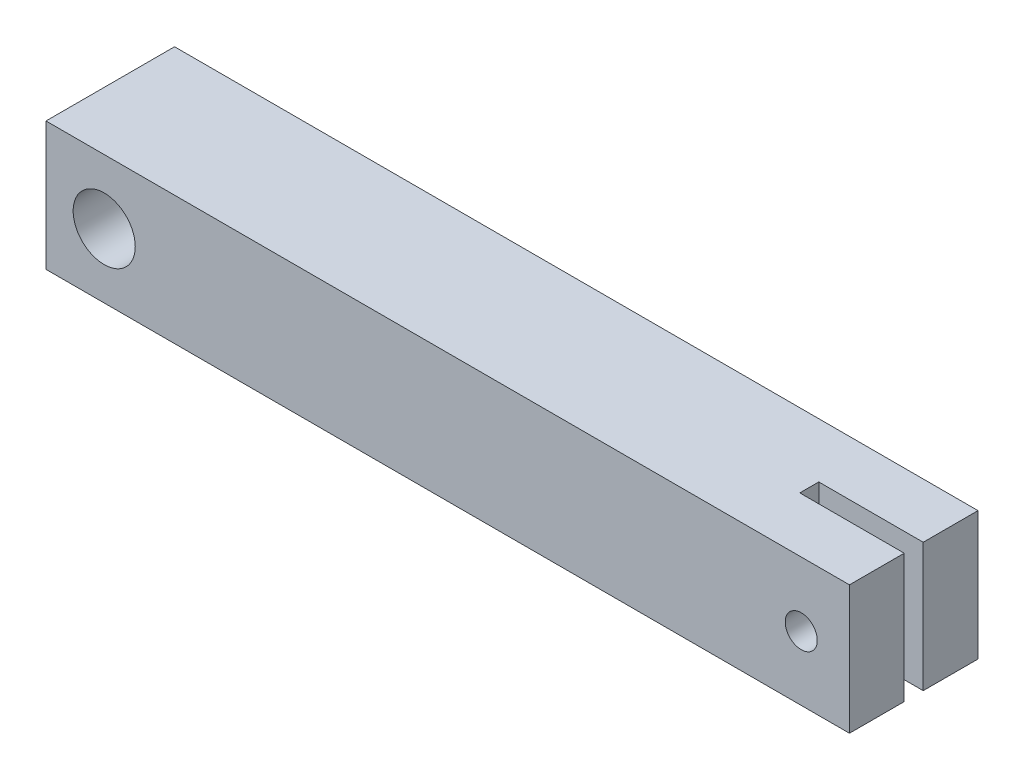
ISO-10303-21;
HEADER;
FILE_DESCRIPTION(('STEP AP214'),'2;1');
FILE_NAME('part.step','',(''),(''),'','','');
FILE_SCHEMA(('AUTOMOTIVE_DESIGN { 1 0 10303 214 1 1 1 1 }'));
ENDSEC;
DATA;
#1=APPLICATION_CONTEXT('core data for automotive mechanical design processes');
#2=APPLICATION_PROTOCOL_DEFINITION('international standard','automotive_design',2000,#1);
#3=PRODUCT_CONTEXT('',#1,'mechanical');
#4=PRODUCT('Part','Part','',(#3));
#5=PRODUCT_RELATED_PRODUCT_CATEGORY('part','',(#4));
#6=PRODUCT_DEFINITION_FORMATION('','',#4);
#7=PRODUCT_DEFINITION_CONTEXT('part definition',#1,'design');
#8=PRODUCT_DEFINITION('design','',#6,#7);
#9=PRODUCT_DEFINITION_SHAPE('','',#8);
#10=(LENGTH_UNIT() NAMED_UNIT(*) SI_UNIT(.MILLI.,.METRE.));
#11=(NAMED_UNIT(*) PLANE_ANGLE_UNIT() SI_UNIT($,.RADIAN.));
#12=(NAMED_UNIT(*) SI_UNIT($,.STERADIAN.) SOLID_ANGLE_UNIT());
#13=UNCERTAINTY_MEASURE_WITH_UNIT(LENGTH_MEASURE(1.E-05),#10,'distance_accuracy_value','');
#14=(GEOMETRIC_REPRESENTATION_CONTEXT(3) GLOBAL_UNCERTAINTY_ASSIGNED_CONTEXT((#13)) GLOBAL_UNIT_ASSIGNED_CONTEXT((#10,
#11,#12)) REPRESENTATION_CONTEXT('',''));
#15=CARTESIAN_POINT('',(0.,0.,0.));
#16=DIRECTION('',(0.,0.,1.));
#17=DIRECTION('',(1.,0.,0.));
#18=AXIS2_PLACEMENT_3D('',#15,#16,#17);
#19=CARTESIAN_POINT('',(25.,-4.,4.));
#20=DIRECTION('',(-1.,0.,0.));
#21=DIRECTION('',(0.,0.,1.));
#22=AXIS2_PLACEMENT_3D('',#19,#20,#21);
#23=PLANE('',#22);
#24=DIRECTION('',(0.,0.,-1.));
#25=VECTOR('',#24,1.);
#26=CARTESIAN_POINT('',(25.,4.,4.));
#27=LINE('',#26,#25);
#28=CARTESIAN_POINT('',(25.,4.,-0.590256031884399));
#29=VERTEX_POINT('',#28);
#30=CARTESIAN_POINT('',(25.,4.,-4.));
#31=VERTEX_POINT('',#30);
#32=EDGE_CURVE('E171',#29,#31,#27,.T.);
#33=ORIENTED_EDGE('',*,*,#32,.F.);
#34=DIRECTION('',(0.,-1.,0.));
#35=VECTOR('',#34,1.);
#36=CARTESIAN_POINT('',(25.,-4.,-0.590256031884399));
#37=LINE('',#36,#35);
#38=CARTESIAN_POINT('',(25.,-4.00000000000001,-0.590256031884399));
#39=VERTEX_POINT('',#38);
#40=EDGE_CURVE('E138',#29,#39,#37,.T.);
#41=ORIENTED_EDGE('',*,*,#40,.T.);
#42=DIRECTION('',(0.,0.,-1.));
#43=VECTOR('',#42,1.);
#44=CARTESIAN_POINT('',(25.,-4.,4.));
#45=LINE('',#44,#43);
#46=CARTESIAN_POINT('',(25.,-4.,-4.));
#47=VERTEX_POINT('',#46);
#48=EDGE_CURVE('E175',#39,#47,#45,.T.);
#49=ORIENTED_EDGE('',*,*,#48,.T.);
#50=DIRECTION('',(0.,1.,0.));
#51=VECTOR('',#50,1.);
#52=CARTESIAN_POINT('',(25.,-4.,-4.));
#53=LINE('',#52,#51);
#54=EDGE_CURVE('E166',#47,#31,#53,.T.);
#55=ORIENTED_EDGE('',*,*,#54,.T.);
#56=EDGE_LOOP('',(#33,#41,#49,#55));
#57=FACE_BOUND('',#56,.T.);
#58=ADVANCED_FACE('F33',(#57),#23,.F.);
#59=CARTESIAN_POINT('',(22.,0.,4.));
#60=DIRECTION('',(0.,0.,-1.));
#61=DIRECTION('',(-1.,0.,0.));
#62=AXIS2_PLACEMENT_3D('',#59,#60,#61);
#63=CYLINDRICAL_SURFACE('',#62,0.996557478128592);
#64=CARTESIAN_POINT('',(22.,0.,-0.590256031884399));
#65=DIRECTION('',(0.,0.,-1.));
#66=DIRECTION('',(-1.,0.,0.));
#67=AXIS2_PLACEMENT_3D('',#64,#65,#66);
#68=CIRCLE('',#67,0.996557478128592);
#69=CARTESIAN_POINT('',(21.0034425218714,0.,-0.590256031884399));
#70=VERTEX_POINT('',#69);
#71=EDGE_CURVE('E37',#70,#70,#68,.T.);
#72=ORIENTED_EDGE('',*,*,#71,.F.);
#73=EDGE_LOOP('',(#72));
#74=FACE_BOUND('',#73,.T.);
#75=CARTESIAN_POINT('',(22.,0.,-4.));
#76=DIRECTION('',(0.,0.,1.));
#77=DIRECTION('',(1.,0.,0.));
#78=AXIS2_PLACEMENT_3D('',#75,#76,#77);
#79=CIRCLE('',#78,0.996557478128592);
#80=CARTESIAN_POINT('',(22.9965574781286,0.,-4.));
#81=VERTEX_POINT('',#80);
#82=EDGE_CURVE('E141',#81,#81,#79,.T.);
#83=ORIENTED_EDGE('',*,*,#82,.F.);
#84=EDGE_LOOP('',(#83));
#85=FACE_BOUND('',#84,.T.);
#86=ADVANCED_FACE('F186',(#74,#85),#63,.F.);
#87=CARTESIAN_POINT('',(0.,0.,4.));
#88=DIRECTION('',(0.,0.,1.));
#89=DIRECTION('',(1.,0.,0.));
#90=AXIS2_PLACEMENT_3D('',#87,#88,#89);
#91=PLANE('',#90);
#92=CARTESIAN_POINT('',(-21.3778151077355,0.,4.));
#93=DIRECTION('',(0.,0.,1.));
#94=DIRECTION('',(1.,0.,0.));
#95=AXIS2_PLACEMENT_3D('',#92,#93,#94);
#96=CIRCLE('',#95,1.93276600630648);
#97=CARTESIAN_POINT('',(-19.445049101429,0.,4.));
#98=VERTEX_POINT('',#97);
#99=EDGE_CURVE('E148',#98,#98,#96,.T.);
#100=ORIENTED_EDGE('',*,*,#99,.F.);
#101=EDGE_LOOP('',(#100));
#102=FACE_BOUND('',#101,.T.);
#103=DIRECTION('',(0.,-1.,0.));
#104=VECTOR('',#103,1.);
#105=CARTESIAN_POINT('',(-25.,-4.,4.));
#106=LINE('',#105,#104);
#107=CARTESIAN_POINT('',(-25.,4.,4.));
#108=VERTEX_POINT('',#107);
#109=CARTESIAN_POINT('',(-25.,-4.,4.));
#110=VERTEX_POINT('',#109);
#111=EDGE_CURVE('E154',#108,#110,#106,.T.);
#112=ORIENTED_EDGE('',*,*,#111,.T.);
#113=DIRECTION('',(1.,0.,0.));
#114=VECTOR('',#113,1.);
#115=CARTESIAN_POINT('',(25.,-4.,4.));
#116=LINE('',#115,#114);
#117=CARTESIAN_POINT('',(25.,-4.,4.));
#118=VERTEX_POINT('',#117);
#119=EDGE_CURVE('E86',#110,#118,#116,.T.);
#120=ORIENTED_EDGE('',*,*,#119,.T.);
#121=DIRECTION('',(0.,1.,0.));
#122=VECTOR('',#121,1.);
#123=CARTESIAN_POINT('',(25.,-4.,4.));
#124=LINE('',#123,#122);
#125=CARTESIAN_POINT('',(25.,4.,4.));
#126=VERTEX_POINT('',#125);
#127=EDGE_CURVE('E157',#118,#126,#124,.T.);
#128=ORIENTED_EDGE('',*,*,#127,.T.);
#129=DIRECTION('',(-1.,0.,0.));
#130=VECTOR('',#129,1.);
#131=CARTESIAN_POINT('',(25.,4.,4.));
#132=LINE('',#131,#130);
#133=EDGE_CURVE('E59',#126,#108,#132,.T.);
#134=ORIENTED_EDGE('',*,*,#133,.T.);
#135=EDGE_LOOP('',(#112,#120,#128,#134));
#136=FACE_BOUND('',#135,.T.);
#137=CARTESIAN_POINT('',(22.,0.,4.));
#138=DIRECTION('',(0.,0.,1.));
#139=DIRECTION('',(1.,0.,0.));
#140=AXIS2_PLACEMENT_3D('',#137,#138,#139);
#141=CIRCLE('',#140,0.996557478128592);
#142=CARTESIAN_POINT('',(22.9965574781286,0.,4.));
#143=VERTEX_POINT('',#142);
#144=EDGE_CURVE('E142',#143,#143,#141,.T.);
#145=ORIENTED_EDGE('',*,*,#144,.F.);
#146=EDGE_LOOP('',(#145));
#147=FACE_BOUND('',#146,.T.);
#148=ADVANCED_FACE('F189',(#102,#136,#147),#91,.T.);
#149=CARTESIAN_POINT('',(0.,0.,-4.));
#150=DIRECTION('',(0.,0.,1.));
#151=DIRECTION('',(1.,0.,0.));
#152=AXIS2_PLACEMENT_3D('',#149,#150,#151);
#153=PLANE('',#152);
#154=DIRECTION('',(0.,-1.,0.));
#155=VECTOR('',#154,1.);
#156=CARTESIAN_POINT('',(-25.,-4.,-4.));
#157=LINE('',#156,#155);
#158=CARTESIAN_POINT('',(-25.,4.,-4.));
#159=VERTEX_POINT('',#158);
#160=CARTESIAN_POINT('',(-25.,-4.,-4.));
#161=VERTEX_POINT('',#160);
#162=EDGE_CURVE('E151',#159,#161,#157,.T.);
#163=ORIENTED_EDGE('',*,*,#162,.F.);
#164=DIRECTION('',(-1.,0.,0.));
#165=VECTOR('',#164,1.);
#166=CARTESIAN_POINT('',(25.,4.,-4.));
#167=LINE('',#166,#165);
#168=EDGE_CURVE('E79',#31,#159,#167,.T.);
#169=ORIENTED_EDGE('',*,*,#168,.F.);
#170=ORIENTED_EDGE('',*,*,#54,.F.);
#171=DIRECTION('',(1.,0.,0.));
#172=VECTOR('',#171,1.);
#173=CARTESIAN_POINT('',(25.,-4.,-4.));
#174=LINE('',#173,#172);
#175=EDGE_CURVE('E163',#161,#47,#174,.T.);
#176=ORIENTED_EDGE('',*,*,#175,.F.);
#177=EDGE_LOOP('',(#163,#169,#170,#176));
#178=FACE_BOUND('',#177,.T.);
#179=CARTESIAN_POINT('',(-21.3778151077355,0.,-4.));
#180=DIRECTION('',(0.,0.,1.));
#181=DIRECTION('',(1.,0.,0.));
#182=AXIS2_PLACEMENT_3D('',#179,#180,#181);
#183=CIRCLE('',#182,1.93276600630648);
#184=CARTESIAN_POINT('',(-19.445049101429,0.,-4.));
#185=VERTEX_POINT('',#184);
#186=EDGE_CURVE('E145',#185,#185,#183,.T.);
#187=ORIENTED_EDGE('',*,*,#186,.T.);
#188=EDGE_LOOP('',(#187));
#189=FACE_BOUND('',#188,.T.);
#190=ORIENTED_EDGE('',*,*,#82,.T.);
#191=EDGE_LOOP('',(#190));
#192=FACE_BOUND('',#191,.T.);
#193=ADVANCED_FACE('F191',(#178,#189,#192),#153,.F.);
#194=CARTESIAN_POINT('',(-25.,-4.,4.));
#195=DIRECTION('',(1.,0.,0.));
#196=DIRECTION('',(0.,0.,-1.));
#197=AXIS2_PLACEMENT_3D('',#194,#195,#196);
#198=PLANE('',#197);
#199=ORIENTED_EDGE('',*,*,#162,.T.);
#200=DIRECTION('',(0.,0.,-1.));
#201=VECTOR('',#200,1.);
#202=CARTESIAN_POINT('',(-25.,-4.,4.));
#203=LINE('',#202,#201);
#204=EDGE_CURVE('E11',#110,#161,#203,.T.);
#205=ORIENTED_EDGE('',*,*,#204,.F.);
#206=ORIENTED_EDGE('',*,*,#111,.F.);
#207=DIRECTION('',(0.,0.,-1.));
#208=VECTOR('',#207,1.);
#209=CARTESIAN_POINT('',(-25.,4.,4.));
#210=LINE('',#209,#208);
#211=EDGE_CURVE('E160',#108,#159,#210,.T.);
#212=ORIENTED_EDGE('',*,*,#211,.T.);
#213=EDGE_LOOP('',(#199,#205,#206,#212));
#214=FACE_BOUND('',#213,.T.);
#215=ADVANCED_FACE('F35',(#214),#198,.F.);
#216=CARTESIAN_POINT('',(25.,-4.,4.));
#217=DIRECTION('',(0.,1.,0.));
#218=DIRECTION('',(-1.,0.,0.));
#219=AXIS2_PLACEMENT_3D('',#216,#217,#218);
#220=PLANE('',#219);
#221=ORIENTED_EDGE('',*,*,#48,.F.);
#222=DIRECTION('',(-1.,0.,0.));
#223=VECTOR('',#222,1.);
#224=CARTESIAN_POINT('',(31.5,-4.,-0.590256031884399));
#225=LINE('',#224,#223);
#226=CARTESIAN_POINT('',(18.5,-4.00000000000001,-0.590256031884398));
#227=VERTEX_POINT('',#226);
#228=EDGE_CURVE('E116',#39,#227,#225,.T.);
#229=ORIENTED_EDGE('',*,*,#228,.T.);
#230=DIRECTION('',(0.,0.,1.));
#231=VECTOR('',#230,1.);
#232=CARTESIAN_POINT('',(18.5,-4.00000000000001,-0.590256031884398));
#233=LINE('',#232,#231);
#234=CARTESIAN_POINT('',(18.5,-4.00000000000001,0.590256031884399));
#235=VERTEX_POINT('',#234);
#236=EDGE_CURVE('E111',#227,#235,#233,.T.);
#237=ORIENTED_EDGE('',*,*,#236,.T.);
#238=DIRECTION('',(1.,0.,0.));
#239=VECTOR('',#238,1.);
#240=CARTESIAN_POINT('',(31.5,-4.,0.590256031884398));
#241=LINE('',#240,#239);
#242=CARTESIAN_POINT('',(25.,-4.00000000000001,0.590256031884399));
#243=VERTEX_POINT('',#242);
#244=EDGE_CURVE('E119',#235,#243,#241,.T.);
#245=ORIENTED_EDGE('',*,*,#244,.T.);
#246=EDGE_CURVE('E42',#118,#243,#45,.T.);
#247=ORIENTED_EDGE('',*,*,#246,.F.);
#248=ORIENTED_EDGE('',*,*,#119,.F.);
#249=ORIENTED_EDGE('',*,*,#204,.T.);
#250=ORIENTED_EDGE('',*,*,#175,.T.);
#251=EDGE_LOOP('',(#221,#229,#237,#245,#247,#248,#249,#250));
#252=FACE_BOUND('',#251,.T.);
#253=ADVANCED_FACE('F126',(#252),#220,.F.);
#254=ORIENTED_EDGE('',*,*,#246,.T.);
#255=DIRECTION('',(0.,1.,0.));
#256=VECTOR('',#255,1.);
#257=CARTESIAN_POINT('',(25.,-4.,0.590256031884399));
#258=LINE('',#257,#256);
#259=CARTESIAN_POINT('',(25.,4.,0.590256031884399));
#260=VERTEX_POINT('',#259);
#261=EDGE_CURVE('E122',#243,#260,#258,.T.);
#262=ORIENTED_EDGE('',*,*,#261,.T.);
#263=EDGE_CURVE('E172',#126,#260,#27,.T.);
#264=ORIENTED_EDGE('',*,*,#263,.F.);
#265=ORIENTED_EDGE('',*,*,#127,.F.);
#266=EDGE_LOOP('',(#254,#262,#264,#265));
#267=FACE_BOUND('',#266,.T.);
#268=ADVANCED_FACE('F206',(#267),#23,.F.);
#269=CARTESIAN_POINT('',(25.,4.,4.));
#270=DIRECTION('',(0.,-1.,0.));
#271=DIRECTION('',(1.,0.,0.));
#272=AXIS2_PLACEMENT_3D('',#269,#270,#271);
#273=PLANE('',#272);
#274=DIRECTION('',(0.,0.,1.));
#275=VECTOR('',#274,1.);
#276=CARTESIAN_POINT('',(18.5,4.,-0.590256031884398));
#277=LINE('',#276,#275);
#278=CARTESIAN_POINT('',(18.5,4.,-0.590256031884398));
#279=VERTEX_POINT('',#278);
#280=CARTESIAN_POINT('',(18.5,4.,0.5902560318844));
#281=VERTEX_POINT('',#280);
#282=EDGE_CURVE('E50',#279,#281,#277,.T.);
#283=ORIENTED_EDGE('',*,*,#282,.F.);
#284=DIRECTION('',(-1.,0.,0.));
#285=VECTOR('',#284,1.);
#286=CARTESIAN_POINT('',(31.5,4.,-0.590256031884399));
#287=LINE('',#286,#285);
#288=EDGE_CURVE('E127',#29,#279,#287,.T.);
#289=ORIENTED_EDGE('',*,*,#288,.F.);
#290=ORIENTED_EDGE('',*,*,#32,.T.);
#291=ORIENTED_EDGE('',*,*,#168,.T.);
#292=ORIENTED_EDGE('',*,*,#211,.F.);
#293=ORIENTED_EDGE('',*,*,#133,.F.);
#294=ORIENTED_EDGE('',*,*,#263,.T.);
#295=DIRECTION('',(1.,0.,0.));
#296=VECTOR('',#295,1.);
#297=CARTESIAN_POINT('',(31.5,4.,0.590256031884398));
#298=LINE('',#297,#296);
#299=EDGE_CURVE('E129',#281,#260,#298,.T.);
#300=ORIENTED_EDGE('',*,*,#299,.F.);
#301=EDGE_LOOP('',(#283,#289,#290,#291,#292,#293,#294,#300));
#302=FACE_BOUND('',#301,.T.);
#303=ADVANCED_FACE('F212',(#302),#273,.F.);
#304=CARTESIAN_POINT('',(-21.3778151077355,0.,4.));
#305=DIRECTION('',(0.,0.,-1.));
#306=DIRECTION('',(-1.,0.,0.));
#307=AXIS2_PLACEMENT_3D('',#304,#305,#306);
#308=CYLINDRICAL_SURFACE('',#307,1.93276600630648);
#309=ORIENTED_EDGE('',*,*,#99,.T.);
#310=EDGE_LOOP('',(#309));
#311=FACE_BOUND('',#310,.T.);
#312=ORIENTED_EDGE('',*,*,#186,.F.);
#313=EDGE_LOOP('',(#312));
#314=FACE_BOUND('',#313,.T.);
#315=ADVANCED_FACE('F184',(#311,#314),#308,.F.);
#316=CARTESIAN_POINT('',(22.,0.,0.590256031884399));
#317=DIRECTION('',(0.,0.,1.));
#318=DIRECTION('',(1.,0.,0.));
#319=AXIS2_PLACEMENT_3D('',#316,#317,#318);
#320=CIRCLE('',#319,0.996557478128592);
#321=CARTESIAN_POINT('',(22.9965574781286,0.,0.590256031884399));
#322=VERTEX_POINT('',#321);
#323=EDGE_CURVE('E135',#322,#322,#320,.T.);
#324=ORIENTED_EDGE('',*,*,#323,.F.);
#325=EDGE_LOOP('',(#324));
#326=FACE_BOUND('',#325,.T.);
#327=ORIENTED_EDGE('',*,*,#144,.T.);
#328=EDGE_LOOP('',(#327));
#329=FACE_BOUND('',#328,.T.);
#330=ADVANCED_FACE('F180',(#326,#329),#63,.F.);
#331=CARTESIAN_POINT('',(31.5,-4.,-0.590256031884399));
#332=DIRECTION('',(0.,0.,-1.));
#333=DIRECTION('',(-1.,0.,0.));
#334=AXIS2_PLACEMENT_3D('',#331,#332,#333);
#335=PLANE('',#334);
#336=ORIENTED_EDGE('',*,*,#71,.T.);
#337=EDGE_LOOP('',(#336));
#338=FACE_BOUND('',#337,.T.);
#339=ORIENTED_EDGE('',*,*,#288,.T.);
#340=DIRECTION('',(0.,1.,0.));
#341=VECTOR('',#340,1.);
#342=CARTESIAN_POINT('',(18.5,-4.00000000000001,-0.590256031884398));
#343=LINE('',#342,#341);
#344=EDGE_CURVE('E115',#227,#279,#343,.T.);
#345=ORIENTED_EDGE('',*,*,#344,.F.);
#346=ORIENTED_EDGE('',*,*,#228,.F.);
#347=ORIENTED_EDGE('',*,*,#40,.F.);
#348=EDGE_LOOP('',(#339,#345,#346,#347));
#349=FACE_BOUND('',#348,.T.);
#350=ADVANCED_FACE('F183',(#338,#349),#335,.F.);
#351=CARTESIAN_POINT('',(31.5,-4.,0.590256031884398));
#352=DIRECTION('',(0.,0.,1.));
#353=DIRECTION('',(1.,0.,0.));
#354=AXIS2_PLACEMENT_3D('',#351,#352,#353);
#355=PLANE('',#354);
#356=ORIENTED_EDGE('',*,*,#323,.T.);
#357=EDGE_LOOP('',(#356));
#358=FACE_BOUND('',#357,.T.);
#359=ORIENTED_EDGE('',*,*,#244,.F.);
#360=DIRECTION('',(0.,1.,0.));
#361=VECTOR('',#360,1.);
#362=CARTESIAN_POINT('',(18.5,-4.00000000000001,0.590256031884399));
#363=LINE('',#362,#361);
#364=EDGE_CURVE('E107',#235,#281,#363,.T.);
#365=ORIENTED_EDGE('',*,*,#364,.T.);
#366=ORIENTED_EDGE('',*,*,#299,.T.);
#367=ORIENTED_EDGE('',*,*,#261,.F.);
#368=EDGE_LOOP('',(#359,#365,#366,#367));
#369=FACE_BOUND('',#368,.T.);
#370=ADVANCED_FACE('F120',(#358,#369),#355,.F.);
#371=CARTESIAN_POINT('',(18.5,-4.00000000000001,-0.590256031884398));
#372=DIRECTION('',(-1.,0.,0.));
#373=DIRECTION('',(0.,-1.,0.));
#374=AXIS2_PLACEMENT_3D('',#371,#372,#373);
#375=PLANE('',#374);
#376=ORIENTED_EDGE('',*,*,#282,.T.);
#377=ORIENTED_EDGE('',*,*,#364,.F.);
#378=ORIENTED_EDGE('',*,*,#236,.F.);
#379=ORIENTED_EDGE('',*,*,#344,.T.);
#380=EDGE_LOOP('',(#376,#377,#378,#379));
#381=FACE_BOUND('',#380,.T.);
#382=ADVANCED_FACE('F109',(#381),#375,.F.);
#383=CLOSED_SHELL('',(#58,#86,#148,#193,#215,#253,#268,#303,#315,#330,#350,#370,#382));
#384=MANIFOLD_SOLID_BREP('B2',#383);
#385=ADVANCED_BREP_SHAPE_REPRESENTATION('',(#18,#384),#14);
#386=SHAPE_DEFINITION_REPRESENTATION(#9,#385);
ENDSEC;
END-ISO-10303-21;
